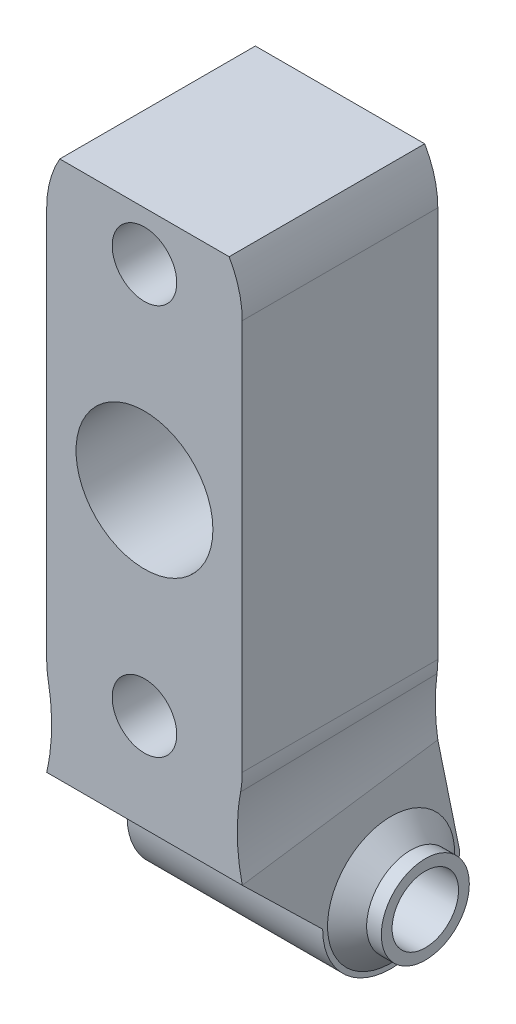
ISO-10303-21;
HEADER;
FILE_DESCRIPTION(('STEP AP214'),'2;1');
FILE_NAME('part.step','',(''),(''),'','','');
FILE_SCHEMA(('AUTOMOTIVE_DESIGN { 1 0 10303 214 1 1 1 1 }'));
ENDSEC;
DATA;
#1=APPLICATION_CONTEXT('core data for automotive mechanical design processes');
#2=APPLICATION_PROTOCOL_DEFINITION('international standard','automotive_design',2000,#1);
#3=PRODUCT_CONTEXT('',#1,'mechanical');
#4=PRODUCT('Part','Part','',(#3));
#5=PRODUCT_RELATED_PRODUCT_CATEGORY('part','',(#4));
#6=PRODUCT_DEFINITION_FORMATION('','',#4);
#7=PRODUCT_DEFINITION_CONTEXT('part definition',#1,'design');
#8=PRODUCT_DEFINITION('design','',#6,#7);
#9=PRODUCT_DEFINITION_SHAPE('','',#8);
#10=(LENGTH_UNIT() NAMED_UNIT(*) SI_UNIT(.MILLI.,.METRE.));
#11=(NAMED_UNIT(*) PLANE_ANGLE_UNIT() SI_UNIT($,.RADIAN.));
#12=(NAMED_UNIT(*) SI_UNIT($,.STERADIAN.) SOLID_ANGLE_UNIT());
#13=UNCERTAINTY_MEASURE_WITH_UNIT(LENGTH_MEASURE(1.E-05),#10,'distance_accuracy_value','');
#14=(GEOMETRIC_REPRESENTATION_CONTEXT(3) GLOBAL_UNCERTAINTY_ASSIGNED_CONTEXT((#13)) GLOBAL_UNIT_ASSIGNED_CONTEXT((#10,
#11,#12)) REPRESENTATION_CONTEXT('',''));
#15=CARTESIAN_POINT('',(0.,0.,0.));
#16=DIRECTION('',(0.,0.,1.));
#17=DIRECTION('',(1.,0.,0.));
#18=AXIS2_PLACEMENT_3D('',#15,#16,#17);
#19=CARTESIAN_POINT('',(0.,10.,10.));
#20=DIRECTION('',(0.,0.,-1.));
#21=DIRECTION('',(-1.,0.,0.));
#22=AXIS2_PLACEMENT_3D('',#19,#20,#21);
#23=CYLINDRICAL_SURFACE('',#22,5.);
#24=CARTESIAN_POINT('',(0.,10.,10.));
#25=DIRECTION('',(0.,0.,1.));
#26=DIRECTION('',(1.,0.,0.));
#27=AXIS2_PLACEMENT_3D('',#24,#25,#26);
#28=CIRCLE('',#27,5.);
#29=CARTESIAN_POINT('',(-4.3301270189222,12.5,10.));
#30=VERTEX_POINT('',#29);
#31=CARTESIAN_POINT('',(-5.,10.,10.));
#32=VERTEX_POINT('',#31);
#33=EDGE_CURVE('E342',#30,#32,#28,.T.);
#34=ORIENTED_EDGE('',*,*,#33,.F.);
#35=DIRECTION('',(0.,0.,-1.));
#36=VECTOR('',#35,1.);
#37=CARTESIAN_POINT('',(-4.3301270189222,12.5,10.));
#38=LINE('',#37,#36);
#39=CARTESIAN_POINT('',(-4.3301270189222,12.5,0.));
#40=VERTEX_POINT('',#39);
#41=EDGE_CURVE('E349',#30,#40,#38,.T.);
#42=ORIENTED_EDGE('',*,*,#41,.T.);
#43=CARTESIAN_POINT('',(0.,10.,0.));
#44=DIRECTION('',(0.,0.,1.));
#45=DIRECTION('',(1.,0.,0.));
#46=AXIS2_PLACEMENT_3D('',#43,#44,#45);
#47=CIRCLE('',#46,5.);
#48=CARTESIAN_POINT('',(-5.,10.,0.));
#49=VERTEX_POINT('',#48);
#50=EDGE_CURVE('E177',#40,#49,#47,.T.);
#51=ORIENTED_EDGE('',*,*,#50,.T.);
#52=DIRECTION('',(0.,0.,-1.));
#53=VECTOR('',#52,1.);
#54=CARTESIAN_POINT('',(-5.,10.,10.));
#55=LINE('',#54,#53);
#56=EDGE_CURVE('E202',#32,#49,#55,.T.);
#57=ORIENTED_EDGE('',*,*,#56,.F.);
#58=EDGE_LOOP('',(#34,#42,#51,#57));
#59=FACE_BOUND('',#58,.T.);
#60=ADVANCED_FACE('F34',(#59),#23,.T.);
#61=CARTESIAN_POINT('',(5.,0.,10.));
#62=DIRECTION('',(1.,0.,0.));
#63=DIRECTION('',(0.,0.,-1.));
#64=AXIS2_PLACEMENT_3D('',#61,#62,#63);
#65=PLANE('',#64);
#66=CARTESIAN_POINT('',(5.,-19.,2.38884796802097));
#67=DIRECTION('',(1.,0.,0.));
#68=DIRECTION('',(0.,0.,-1.));
#69=AXIS2_PLACEMENT_3D('',#66,#67,#68);
#70=CIRCLE('',#69,3.24999999999999);
#71=CARTESIAN_POINT('',(5.,-19.,-0.861152031979026));
#72=VERTEX_POINT('',#71);
#73=EDGE_CURVE('E571',#72,#72,#70,.F.);
#74=ORIENTED_EDGE('',*,*,#73,.T.);
#75=EDGE_LOOP('',(#74));
#76=FACE_BOUND('',#75,.T.);
#77=DIRECTION('',(0.,-0.979775339297235,-0.200100685918334));
#78=VECTOR('',#77,1.);
#79=CARTESIAN_POINT('',(5.,-0.542919919085105,2.65835944285536));
#80=LINE('',#79,#78);
#81=CARTESIAN_POINT('',(5.,-13.5593421924231,0.));
#82=VERTEX_POINT('',#81);
#83=CARTESIAN_POINT('',(5.,-19.,-1.11115203197903));
#84=VERTEX_POINT('',#83);
#85=EDGE_CURVE('E332',#82,#84,#80,.T.);
#86=ORIENTED_EDGE('',*,*,#85,.F.);
#87=DIRECTION('',(0.,0.142593618538282,-0.989781319258026));
#88=VECTOR('',#87,1.);
#89=CARTESIAN_POINT('',(5.,-13.2836409005364,-1.91371809764053));
#90=LINE('',#89,#88);
#91=CARTESIAN_POINT('',(5.,-15.,10.));
#92=VERTEX_POINT('',#91);
#93=EDGE_CURVE('E324',#92,#82,#90,.T.);
#94=ORIENTED_EDGE('',*,*,#93,.F.);
#95=DIRECTION('',(0.,-0.697351394105259,-0.716729400219812));
#96=VECTOR('',#95,1.);
#97=CARTESIAN_POINT('',(5.,-12.7036379614869,12.3601733651982));
#98=LINE('',#97,#96);
#99=CARTESIAN_POINT('',(5.,-19.,5.88884796802097));
#100=VERTEX_POINT('',#99);
#101=EDGE_CURVE('E330',#92,#100,#98,.T.);
#102=ORIENTED_EDGE('',*,*,#101,.T.);
#103=CARTESIAN_POINT('',(5.,-19.,2.38884796802097));
#104=DIRECTION('',(1.,0.,0.));
#105=DIRECTION('',(0.,0.,-1.));
#106=AXIS2_PLACEMENT_3D('',#103,#104,#105);
#107=CIRCLE('',#106,3.5);
#108=EDGE_CURVE('E178',#100,#84,#107,.T.);
#109=ORIENTED_EDGE('',*,*,#108,.T.);
#110=EDGE_LOOP('',(#86,#94,#102,#109));
#111=FACE_BOUND('',#110,.T.);
#112=ADVANCED_FACE('F289',(#76,#111),#65,.T.);
#113=CARTESIAN_POINT('',(-5.,0.,10.));
#114=DIRECTION('',(1.,0.,0.));
#115=DIRECTION('',(0.,0.,-1.));
#116=AXIS2_PLACEMENT_3D('',#113,#114,#115);
#117=PLANE('',#116);
#118=CARTESIAN_POINT('',(-5.,-19.,2.38884796802097));
#119=DIRECTION('',(1.,0.,0.));
#120=DIRECTION('',(0.,0.,-1.));
#121=AXIS2_PLACEMENT_3D('',#118,#119,#120);
#122=CIRCLE('',#121,3.25000000000002);
#123=CARTESIAN_POINT('',(-5.,-19.,-0.861152031979053));
#124=VERTEX_POINT('',#123);
#125=EDGE_CURVE('E11',#124,#124,#122,.T.);
#126=ORIENTED_EDGE('',*,*,#125,.T.);
#127=EDGE_LOOP('',(#126));
#128=FACE_BOUND('',#127,.T.);
#129=CARTESIAN_POINT('',(-5.,-19.,2.38884796802097));
#130=DIRECTION('',(1.,0.,0.));
#131=DIRECTION('',(0.,0.,-1.));
#132=AXIS2_PLACEMENT_3D('',#129,#130,#131);
#133=CIRCLE('',#132,3.5);
#134=CARTESIAN_POINT('',(-5.,-19.,-1.11115203197903));
#135=VERTEX_POINT('',#134);
#136=CARTESIAN_POINT('',(-5.,-19.,5.88884796802097));
#137=VERTEX_POINT('',#136);
#138=EDGE_CURVE('E385',#135,#137,#133,.F.);
#139=ORIENTED_EDGE('',*,*,#138,.T.);
#140=DIRECTION('',(0.,0.697351394105259,0.716729400219812));
#141=VECTOR('',#140,1.);
#142=CARTESIAN_POINT('',(-5.,-12.7036379614869,12.3601733651982));
#143=LINE('',#142,#141);
#144=CARTESIAN_POINT('',(-5.,-15.,10.));
#145=VERTEX_POINT('',#144);
#146=EDGE_CURVE('E388',#137,#145,#143,.T.);
#147=ORIENTED_EDGE('',*,*,#146,.T.);
#148=DIRECTION('',(0.,-0.142593618538282,0.989781319258026));
#149=VECTOR('',#148,1.);
#150=CARTESIAN_POINT('',(-5.,-13.2836409005364,-1.91371809764053));
#151=LINE('',#150,#149);
#152=CARTESIAN_POINT('',(-5.,-13.5593421924231,0.));
#153=VERTEX_POINT('',#152);
#154=EDGE_CURVE('E136',#153,#145,#151,.T.);
#155=ORIENTED_EDGE('',*,*,#154,.F.);
#156=DIRECTION('',(0.,0.979775339297235,0.200100685918334));
#157=VECTOR('',#156,1.);
#158=CARTESIAN_POINT('',(-5.,-0.542919919085105,2.65835944285536));
#159=LINE('',#158,#157);
#160=EDGE_CURVE('E338',#135,#153,#159,.T.);
#161=ORIENTED_EDGE('',*,*,#160,.F.);
#162=EDGE_LOOP('',(#139,#147,#155,#161));
#163=FACE_BOUND('',#162,.T.);
#164=ADVANCED_FACE('F295',(#128,#163),#117,.F.);
#165=CARTESIAN_POINT('',(0.,-10.,10.));
#166=DIRECTION('',(0.,0.,-1.));
#167=DIRECTION('',(-1.,0.,0.));
#168=AXIS2_PLACEMENT_3D('',#165,#166,#167);
#169=CYLINDRICAL_SURFACE('',#168,5.);
#170=CARTESIAN_POINT('',(0.,-10.,0.));
#171=DIRECTION('',(0.,0.,1.));
#172=DIRECTION('',(1.,0.,0.));
#173=AXIS2_PLACEMENT_3D('',#170,#171,#172);
#174=CIRCLE('',#173,5.);
#175=CARTESIAN_POINT('',(-5.,-10.,0.));
#176=VERTEX_POINT('',#175);
#177=CARTESIAN_POINT('',(-4.95751117637002,-10.6504482578702,0.));
#178=VERTEX_POINT('',#177);
#179=EDGE_CURVE('E149',#176,#178,#174,.T.);
#180=ORIENTED_EDGE('',*,*,#179,.T.);
#181=CARTESIAN_POINT('',(-5.,-15.4355662845991,13.0233847504125));
#182=CARTESIAN_POINT('',(-4.44220527723996,-13.2302958211713,13.189043904644));
#183=CARTESIAN_POINT('',(-4.89832509522828,-11.0032005090992,13.3728832572638));
#184=CARTESIAN_POINT('',(-5.,-15.198424623606,11.3773196005489));
#185=CARTESIAN_POINT('',(-4.49195205682825,-13.0886455388384,11.5403303155306));
#186=CARTESIAN_POINT('',(-4.90730936356108,-10.9593299813514,11.7116148343541));
#187=CARTESIAN_POINT('',(-5.,-14.9612792982853,9.7312290155856));
#188=CARTESIAN_POINT('',(-4.53825727444031,-12.9468427536556,9.88718640022528));
#189=CARTESIAN_POINT('',(-4.91567666755318,-10.9154796135729,10.0503117353569));
#190=CARTESIAN_POINT('',(-5.,-14.4869834905433,6.43901204881145));
#191=CARTESIAN_POINT('',(-4.623891721141,-12.6636831423943,6.5815658466589));
#192=CARTESIAN_POINT('',(-4.93119738978409,-10.8278136202016,6.72765398207385));
#193=CARTESIAN_POINT('',(-5.,-14.2498330081509,4.79288566720186));
#194=CARTESIAN_POINT('',(-4.66327404969323,-12.5222386295594,4.92808318404762));
#195=CARTESIAN_POINT('',(-4.93835081364852,-10.7839979944488,5.06629932806257));
#196=CARTESIAN_POINT('',(-5.,-13.7755268678021,1.50059697897684));
#197=CARTESIAN_POINT('',(-4.73527696836469,-12.239732343715,1.62183972234405));
#198=CARTESIAN_POINT('',(-4.95146390123223,-10.6963955023379,1.74354091967718));
#199=CARTESIAN_POINT('',(-5.,-13.5383712098458,-0.14556532763738));
#200=CARTESIAN_POINT('',(-4.76794101610711,-12.0985853870542,-0.0319057415052614));
#201=CARTESIAN_POINT('',(-4.95742356499223,-10.6526086359787,0.0821371653047414));
#202=CARTESIAN_POINT('',(-5.,-13.0640545954361,-3.43792671918469));
#203=CARTESIAN_POINT('',(-4.82668235743353,-11.8166124248527,-3.33866446489152));
#204=CARTESIAN_POINT('',(-4.96816396417613,-10.5650580675183,-3.24071789662139));
#205=CARTESIAN_POINT('',(-5.,-12.8268936389631,-5.08412580425288));
#206=CARTESIAN_POINT('',(-4.85279432668287,-11.6757031485389,-4.99264620153091));
#207=CARTESIAN_POINT('',(-4.97294469413619,-10.5212943655254,-4.90216920435978));
#208=CARTESIAN_POINT('',(-5.,-12.5897310749049,-6.73033604801049));
#209=CARTESIAN_POINT('',(-4.87570460122613,-11.5347820583627,-6.64793207254503));
#210=CARTESIAN_POINT('',(-4.97714334543139,-10.4775396517862,-6.56363578708386));
#211=(BOUNDED_SURFACE() B_SPLINE_SURFACE(3,2,((#181,#182,#183),(#184,#185,#186),(#187,#188,
#189),(#190,#191,#192),(#193,#194,#195),(#196,#197,#198),(#199,#200,#201),(#202,#203,#204),
(#205,#206,#207),(#208,#209,#210)),.UNSPECIFIED.,.F.,.F.,.F.) B_SPLINE_SURFACE_WITH_KNOTS((4,2,
2,2,4),(3,3),(0.,5.0000735121336,10.0001238512251,15.0001740198006,20.0002473609248),(0.,1.),
.UNSPECIFIED.) GEOMETRIC_REPRESENTATION_ITEM() RATIONAL_B_SPLINE_SURFACE(((1.,0.974963648860338,
1.),(1.,0.977176073750898,1.),(1.,0.979236530609515,1.),(1.,0.983058469732894,1.),(1.,
0.984819953383221,1.),(1.,0.988048927919992,1.),(1.,0.98951641881646,1.),(1.,0.992161079273093,
1.),(1.,0.993338247487742,1.),(1.,0.994372083262162,1.))) REPRESENTATION_ITEM('') SURFACE());
#212=CARTESIAN_POINT('',(-4.97714334543139,-10.4775396517862,-6.56363578708386));
#213=CARTESIAN_POINT('',(-4.9729446941362,-10.5212943655254,-4.90216920435978));
#214=CARTESIAN_POINT('',(-4.96816396417613,-10.5650580675183,-3.24071789662139));
#215=CARTESIAN_POINT('',(-4.95742356499223,-10.6526086359787,0.0821371653047407));
#216=CARTESIAN_POINT('',(-4.95146390123223,-10.6963955023379,1.74354091967718));
#217=CARTESIAN_POINT('',(-4.93835081364852,-10.7839979944488,5.06629932806257));
#218=CARTESIAN_POINT('',(-4.93119738978409,-10.8278136202016,6.72765398207385));
#219=CARTESIAN_POINT('',(-4.91567666755319,-10.9154796135729,10.0503117353569));
#220=CARTESIAN_POINT('',(-4.90730936356108,-10.9593299813514,11.7116148343541));
#221=CARTESIAN_POINT('',(-4.89832509522828,-11.0032005090992,13.3728832572638));
#222=B_SPLINE_CURVE_WITH_KNOTS('',3,(#212,#213,#214,#215,#216,#217,#218,#219,#220,#221),
.UNSPECIFIED.,.F.,.F.,(4,2,2,2,4),(0.,5.00007334112417,10.0001235096997,15.0001738487912,
20.0002473609248),.UNSPECIFIED.);
#223=CARTESIAN_POINT('',(-4.91572123924434,-10.914157917453,10.));
#224=VERTEX_POINT('',#223);
#225=EDGE_CURVE('E135',#178,#224,#222,.T.);
#226=ORIENTED_EDGE('',*,*,#225,.T.);
#227=CARTESIAN_POINT('',(0.,-10.,10.));
#228=DIRECTION('',(0.,0.,1.));
#229=DIRECTION('',(1.,0.,0.));
#230=AXIS2_PLACEMENT_3D('',#227,#228,#229);
#231=CIRCLE('',#230,5.);
#232=CARTESIAN_POINT('',(-5.,-10.,10.));
#233=VERTEX_POINT('',#232);
#234=EDGE_CURVE('E147',#233,#224,#231,.T.);
#235=ORIENTED_EDGE('',*,*,#234,.F.);
#236=DIRECTION('',(0.,0.,-1.));
#237=VECTOR('',#236,1.);
#238=CARTESIAN_POINT('',(-5.,-10.,10.));
#239=LINE('',#238,#237);
#240=EDGE_CURVE('E200',#233,#176,#239,.T.);
#241=ORIENTED_EDGE('',*,*,#240,.T.);
#242=EDGE_LOOP('',(#180,#226,#235,#241));
#243=FACE_BOUND('',#242,.T.);
#244=ADVANCED_FACE('F145',(#243),#169,.T.);
#245=CARTESIAN_POINT('',(5.,10.,0.));
#246=VERTEX_POINT('',#245);
#247=CARTESIAN_POINT('',(4.3301270189222,12.5,0.));
#248=VERTEX_POINT('',#247);
#249=EDGE_CURVE('E179',#246,#248,#47,.T.);
#250=ORIENTED_EDGE('',*,*,#249,.T.);
#251=DIRECTION('',(0.,0.,-1.));
#252=VECTOR('',#251,1.);
#253=CARTESIAN_POINT('',(4.3301270189222,12.5,10.));
#254=LINE('',#253,#252);
#255=CARTESIAN_POINT('',(4.3301270189222,12.5,10.));
#256=VERTEX_POINT('',#255);
#257=EDGE_CURVE('E49',#248,#256,#254,.F.);
#258=ORIENTED_EDGE('',*,*,#257,.T.);
#259=CARTESIAN_POINT('',(5.,10.,10.));
#260=VERTEX_POINT('',#259);
#261=EDGE_CURVE('E343',#260,#256,#28,.T.);
#262=ORIENTED_EDGE('',*,*,#261,.F.);
#263=DIRECTION('',(0.,0.,-1.));
#264=VECTOR('',#263,1.);
#265=CARTESIAN_POINT('',(5.,10.,10.));
#266=LINE('',#265,#264);
#267=EDGE_CURVE('E173',#260,#246,#266,.T.);
#268=ORIENTED_EDGE('',*,*,#267,.T.);
#269=EDGE_LOOP('',(#250,#258,#262,#268));
#270=FACE_BOUND('',#269,.T.);
#271=ADVANCED_FACE('F291',(#270),#23,.T.);
#272=CARTESIAN_POINT('',(-5.,0.,10.));
#273=DIRECTION('',(1.,0.,0.));
#274=DIRECTION('',(0.,0.,-1.));
#275=AXIS2_PLACEMENT_3D('',#272,#273,#274);
#276=PLANE('',#275);
#277=DIRECTION('',(0.,-1.,0.));
#278=VECTOR('',#277,1.);
#279=CARTESIAN_POINT('',(-5.,0.,0.));
#280=LINE('',#279,#278);
#281=EDGE_CURVE('E182',#49,#176,#280,.T.);
#282=ORIENTED_EDGE('',*,*,#281,.T.);
#283=ORIENTED_EDGE('',*,*,#240,.F.);
#284=DIRECTION('',(0.,-1.,0.));
#285=VECTOR('',#284,1.);
#286=CARTESIAN_POINT('',(-5.,0.,10.));
#287=LINE('',#286,#285);
#288=EDGE_CURVE('E157',#32,#233,#287,.T.);
#289=ORIENTED_EDGE('',*,*,#288,.F.);
#290=ORIENTED_EDGE('',*,*,#56,.T.);
#291=EDGE_LOOP('',(#282,#283,#289,#290));
#292=FACE_BOUND('',#291,.T.);
#293=ADVANCED_FACE('F299',(#292),#276,.F.);
#294=CARTESIAN_POINT('',(4.91572123924435,-10.914157917453,10.));
#295=VERTEX_POINT('',#294);
#296=CARTESIAN_POINT('',(5.,-10.,10.));
#297=VERTEX_POINT('',#296);
#298=EDGE_CURVE('E160',#295,#297,#231,.T.);
#299=ORIENTED_EDGE('',*,*,#298,.F.);
#300=CARTESIAN_POINT('',(4.89832509522828,-11.0032005090992,13.3728832572638));
#301=CARTESIAN_POINT('',(4.44220527723997,-13.2302958211713,13.189043904644));
#302=CARTESIAN_POINT('',(5.,-15.4355662845991,13.0233847504125));
#303=CARTESIAN_POINT('',(4.90730936356108,-10.9593299813514,11.7116148343541));
#304=CARTESIAN_POINT('',(4.49195205682825,-13.0886455388384,11.5403303155306));
#305=CARTESIAN_POINT('',(5.,-15.198424623606,11.3773196005489));
#306=CARTESIAN_POINT('',(4.91567666755319,-10.9154796135729,10.0503117353569));
#307=CARTESIAN_POINT('',(4.53825727444031,-12.9468427536556,9.88718640022528));
#308=CARTESIAN_POINT('',(5.,-14.9612792982853,9.7312290155856));
#309=CARTESIAN_POINT('',(4.93119738978409,-10.8278136202016,6.72765398207386));
#310=CARTESIAN_POINT('',(4.623891721141,-12.6636831423943,6.5815658466589));
#311=CARTESIAN_POINT('',(5.,-14.4869834905433,6.43901204881145));
#312=CARTESIAN_POINT('',(4.93835081364852,-10.7839979944488,5.06629932806257));
#313=CARTESIAN_POINT('',(4.66327404969323,-12.5222386295594,4.92808318404762));
#314=CARTESIAN_POINT('',(5.,-14.2498330081509,4.79288566720187));
#315=CARTESIAN_POINT('',(4.95146390123223,-10.6963955023379,1.74354091967718));
#316=CARTESIAN_POINT('',(4.73527696836469,-12.239732343715,1.62183972234405));
#317=CARTESIAN_POINT('',(5.,-13.7755268678021,1.50059697897684));
#318=CARTESIAN_POINT('',(4.95742356499223,-10.6526086359787,0.0821371653047425));
#319=CARTESIAN_POINT('',(4.76794101610711,-12.0985853870542,-0.0319057415052574));
#320=CARTESIAN_POINT('',(5.,-13.5383712098458,-0.145565327637377));
#321=CARTESIAN_POINT('',(4.96816396417613,-10.5650580675183,-3.24071789662139));
#322=CARTESIAN_POINT('',(4.82668235743354,-11.8166124248527,-3.33866446489152));
#323=CARTESIAN_POINT('',(5.,-13.0640545954361,-3.43792671918469));
#324=CARTESIAN_POINT('',(4.9729446941362,-10.5212943655254,-4.90216920435978));
#325=CARTESIAN_POINT('',(4.85279432668287,-11.6757031485389,-4.99264620153091));
#326=CARTESIAN_POINT('',(5.,-12.8268936389631,-5.08412580425288));
#327=CARTESIAN_POINT('',(4.97714334543139,-10.4775396517862,-6.56363578708385));
#328=CARTESIAN_POINT('',(4.87570460122613,-11.5347820583627,-6.64793207254502));
#329=CARTESIAN_POINT('',(5.,-12.5897310749049,-6.73033604801048));
#330=(BOUNDED_SURFACE() B_SPLINE_SURFACE(3,2,((#300,#301,#302),(#303,#304,#305),(#306,#307,
#308),(#309,#310,#311),(#312,#313,#314),(#315,#316,#317),(#318,#319,#320),(#321,#322,#323),
(#324,#325,#326),(#327,#328,#329)),.UNSPECIFIED.,.F.,.F.,.F.) B_SPLINE_SURFACE_WITH_KNOTS((4,2,
2,2,4),(3,3),(0.,5.0000735121336,10.0001238512251,15.0001740198006,20.0002473609248),(0.,1.),
.UNSPECIFIED.) GEOMETRIC_REPRESENTATION_ITEM() RATIONAL_B_SPLINE_SURFACE(((1.,0.974963648860338,
1.),(1.,0.977176073750898,1.),(1.,0.979236530609515,1.),(1.,0.983058469732894,1.),(1.,
0.984819953383222,1.),(1.,0.988048927919992,1.),(1.,0.98951641881646,1.),(1.,0.992161079273093,
1.),(1.,0.993338247487742,1.),(1.,0.994372083262162,1.))) REPRESENTATION_ITEM('') SURFACE());
#331=CARTESIAN_POINT('',(4.89832509522828,-11.0032005090992,13.3728832572638));
#332=CARTESIAN_POINT('',(4.90730936356108,-10.9593299813514,11.7116148343541));
#333=CARTESIAN_POINT('',(4.91567666755319,-10.9154796135729,10.0503117353569));
#334=CARTESIAN_POINT('',(4.93119738978409,-10.8278136202016,6.72765398207385));
#335=CARTESIAN_POINT('',(4.93835081364852,-10.7839979944488,5.06629932806257));
#336=CARTESIAN_POINT('',(4.95146390123223,-10.6963955023379,1.74354091967718));
#337=CARTESIAN_POINT('',(4.95742356499223,-10.6526086359787,0.0821371653047416));
#338=CARTESIAN_POINT('',(4.96816396417613,-10.5650580675183,-3.24071789662139));
#339=CARTESIAN_POINT('',(4.9729446941362,-10.5212943655254,-4.90216920435978));
#340=CARTESIAN_POINT('',(4.97714334543139,-10.4775396517862,-6.56363578708385));
#341=B_SPLINE_CURVE_WITH_KNOTS('',3,(#331,#332,#333,#334,#335,#336,#337,#338,#339,#340),
.UNSPECIFIED.,.F.,.F.,(4,2,2,2,4),(0.,5.0000735121336,10.0001238512251,15.0001740198006,
20.0002473609248),.UNSPECIFIED.);
#342=CARTESIAN_POINT('',(4.95751117637002,-10.6504482578702,0.));
#343=VERTEX_POINT('',#342);
#344=EDGE_CURVE('E151',#295,#343,#341,.T.);
#345=ORIENTED_EDGE('',*,*,#344,.T.);
#346=CARTESIAN_POINT('',(5.,-10.,0.));
#347=VERTEX_POINT('',#346);
#348=EDGE_CURVE('E184',#343,#347,#174,.T.);
#349=ORIENTED_EDGE('',*,*,#348,.T.);
#350=DIRECTION('',(0.,0.,-1.));
#351=VECTOR('',#350,1.);
#352=CARTESIAN_POINT('',(5.,-10.,10.));
#353=LINE('',#352,#351);
#354=EDGE_CURVE('E197',#297,#347,#353,.T.);
#355=ORIENTED_EDGE('',*,*,#354,.F.);
#356=EDGE_LOOP('',(#299,#345,#349,#355));
#357=FACE_BOUND('',#356,.T.);
#358=ADVANCED_FACE('F219',(#357),#169,.T.);
#359=CARTESIAN_POINT('',(0.,0.,10.));
#360=DIRECTION('',(0.,0.,-1.));
#361=DIRECTION('',(-1.,0.,0.));
#362=AXIS2_PLACEMENT_3D('',#359,#360,#361);
#363=CYLINDRICAL_SURFACE('',#362,3.5);
#364=CARTESIAN_POINT('',(0.,0.,10.));
#365=DIRECTION('',(0.,0.,1.));
#366=DIRECTION('',(1.,0.,0.));
#367=AXIS2_PLACEMENT_3D('',#364,#365,#366);
#368=CIRCLE('',#367,3.5);
#369=CARTESIAN_POINT('',(3.5,0.,10.));
#370=VERTEX_POINT('',#369);
#371=EDGE_CURVE('E163',#370,#370,#368,.T.);
#372=ORIENTED_EDGE('',*,*,#371,.T.);
#373=EDGE_LOOP('',(#372));
#374=FACE_BOUND('',#373,.T.);
#375=CARTESIAN_POINT('',(0.,0.,0.));
#376=DIRECTION('',(0.,0.,1.));
#377=DIRECTION('',(1.,0.,0.));
#378=AXIS2_PLACEMENT_3D('',#375,#376,#377);
#379=CIRCLE('',#378,3.5);
#380=CARTESIAN_POINT('',(3.5,0.,0.));
#381=VERTEX_POINT('',#380);
#382=EDGE_CURVE('E189',#381,#381,#379,.T.);
#383=ORIENTED_EDGE('',*,*,#382,.F.);
#384=EDGE_LOOP('',(#383));
#385=FACE_BOUND('',#384,.T.);
#386=ADVANCED_FACE('F494',(#374,#385),#363,.F.);
#387=CARTESIAN_POINT('',(5.,0.,10.));
#388=DIRECTION('',(1.,0.,0.));
#389=DIRECTION('',(0.,0.,-1.));
#390=AXIS2_PLACEMENT_3D('',#387,#388,#389);
#391=PLANE('',#390);
#392=DIRECTION('',(0.,-1.,0.));
#393=VECTOR('',#392,1.);
#394=CARTESIAN_POINT('',(5.,0.,0.));
#395=LINE('',#394,#393);
#396=EDGE_CURVE('E186',#246,#347,#395,.T.);
#397=ORIENTED_EDGE('',*,*,#396,.F.);
#398=ORIENTED_EDGE('',*,*,#267,.F.);
#399=DIRECTION('',(0.,-1.,0.));
#400=VECTOR('',#399,1.);
#401=CARTESIAN_POINT('',(5.,0.,10.));
#402=LINE('',#401,#400);
#403=EDGE_CURVE('E159',#260,#297,#402,.T.);
#404=ORIENTED_EDGE('',*,*,#403,.T.);
#405=ORIENTED_EDGE('',*,*,#354,.T.);
#406=EDGE_LOOP('',(#397,#398,#404,#405));
#407=FACE_BOUND('',#406,.T.);
#408=ADVANCED_FACE('F315',(#407),#391,.T.);
#409=CARTESIAN_POINT('',(0.,10.,10.));
#410=DIRECTION('',(0.,0.,-1.));
#411=DIRECTION('',(-1.,0.,0.));
#412=AXIS2_PLACEMENT_3D('',#409,#410,#411);
#413=CYLINDRICAL_SURFACE('',#412,1.65);
#414=CARTESIAN_POINT('',(0.,10.,10.));
#415=DIRECTION('',(0.,0.,1.));
#416=DIRECTION('',(1.,0.,0.));
#417=AXIS2_PLACEMENT_3D('',#414,#415,#416);
#418=CIRCLE('',#417,1.65);
#419=CARTESIAN_POINT('',(1.65,10.,10.));
#420=VERTEX_POINT('',#419);
#421=EDGE_CURVE('E195',#420,#420,#418,.T.);
#422=ORIENTED_EDGE('',*,*,#421,.T.);
#423=EDGE_LOOP('',(#422));
#424=FACE_BOUND('',#423,.T.);
#425=CARTESIAN_POINT('',(0.,10.,0.));
#426=DIRECTION('',(0.,0.,1.));
#427=DIRECTION('',(1.,0.,0.));
#428=AXIS2_PLACEMENT_3D('',#425,#426,#427);
#429=CIRCLE('',#428,1.65);
#430=CARTESIAN_POINT('',(1.65,10.,0.));
#431=VERTEX_POINT('',#430);
#432=EDGE_CURVE('E174',#431,#431,#429,.T.);
#433=ORIENTED_EDGE('',*,*,#432,.F.);
#434=EDGE_LOOP('',(#433));
#435=FACE_BOUND('',#434,.T.);
#436=ADVANCED_FACE('F226',(#424,#435),#413,.F.);
#437=CARTESIAN_POINT('',(0.,-10.,10.));
#438=DIRECTION('',(0.,0.,-1.));
#439=DIRECTION('',(-1.,0.,0.));
#440=AXIS2_PLACEMENT_3D('',#437,#438,#439);
#441=CYLINDRICAL_SURFACE('',#440,1.65);
#442=CARTESIAN_POINT('',(0.,-10.,10.));
#443=DIRECTION('',(0.,0.,1.));
#444=DIRECTION('',(1.,0.,0.));
#445=AXIS2_PLACEMENT_3D('',#442,#443,#444);
#446=CIRCLE('',#445,1.65);
#447=CARTESIAN_POINT('',(1.65,-10.,10.));
#448=VERTEX_POINT('',#447);
#449=EDGE_CURVE('E170',#448,#448,#446,.T.);
#450=ORIENTED_EDGE('',*,*,#449,.T.);
#451=EDGE_LOOP('',(#450));
#452=FACE_BOUND('',#451,.T.);
#453=CARTESIAN_POINT('',(0.,-10.,0.));
#454=DIRECTION('',(0.,0.,1.));
#455=DIRECTION('',(1.,0.,0.));
#456=AXIS2_PLACEMENT_3D('',#453,#454,#455);
#457=CIRCLE('',#456,1.65);
#458=CARTESIAN_POINT('',(1.65,-10.,0.));
#459=VERTEX_POINT('',#458);
#460=EDGE_CURVE('E192',#459,#459,#457,.T.);
#461=ORIENTED_EDGE('',*,*,#460,.F.);
#462=EDGE_LOOP('',(#461));
#463=FACE_BOUND('',#462,.T.);
#464=ADVANCED_FACE('F368',(#452,#463),#441,.F.);
#465=CARTESIAN_POINT('',(0.,0.,10.));
#466=DIRECTION('',(0.,0.,1.));
#467=DIRECTION('',(1.,0.,0.));
#468=AXIS2_PLACEMENT_3D('',#465,#466,#467);
#469=PLANE('',#468);
#470=DIRECTION('',(-1.,0.,0.));
#471=VECTOR('',#470,1.);
#472=CARTESIAN_POINT('',(8.93580716293718,12.5,10.));
#473=LINE('',#472,#471);
#474=EDGE_CURVE('E344',#256,#30,#473,.T.);
#475=ORIENTED_EDGE('',*,*,#474,.T.);
#476=ORIENTED_EDGE('',*,*,#33,.T.);
#477=ORIENTED_EDGE('',*,*,#288,.T.);
#478=ORIENTED_EDGE('',*,*,#234,.T.);
#479=CARTESIAN_POINT('',(-4.91572123924434,-10.914157917453,10.));
#480=CARTESIAN_POINT('',(-4.86355369800997,-11.1944997904377,10.));
#481=CARTESIAN_POINT('',(-4.82336177436077,-11.477071726427,10.));
#482=CARTESIAN_POINT('',(-4.76706698838271,-12.044774728936,10.));
#483=CARTESIAN_POINT('',(-4.75097839544977,-12.3299072109308,10.));
#484=CARTESIAN_POINT('',(-4.74315685034231,-12.8956735371384,10.));
#485=CARTESIAN_POINT('',(-4.75101699807947,-13.1763019964913,10.));
#486=CARTESIAN_POINT('',(-4.7901527475443,-13.7357667668125,10.));
#487=CARTESIAN_POINT('',(-4.82141199998185,-14.0146041920653,10.));
#488=CARTESIAN_POINT('',(-4.88259226430447,-14.4101971251059,10.));
#489=CARTESIAN_POINT('',(-4.90306129865687,-14.5284782640445,10.));
#490=CARTESIAN_POINT('',(-4.9483049542573,-14.7646648551134,10.));
#491=CARTESIAN_POINT('',(-4.97309512137527,-14.8825673293482,10.));
#492=CARTESIAN_POINT('',(-5.,-15.,10.));
#493=B_SPLINE_CURVE_WITH_KNOTS('',3,(#479,#480,#481,#482,#483,#484,#485,#486,#487,#488,#489,
#490,#491,#492),.UNSPECIFIED.,.F.,.F.,(4,2,2,2,2,2,4),(0.,0.855212955531403,1.71093200529566,
2.55219354220279,3.39286782563395,3.7529225668664,4.1143004473328),.UNSPECIFIED.);
#494=EDGE_CURVE('E131',#224,#145,#493,.T.);
#495=ORIENTED_EDGE('',*,*,#494,.T.);
#496=DIRECTION('',(1.,0.,0.));
#497=VECTOR('',#496,1.);
#498=CARTESIAN_POINT('',(19.2615939330054,-15.,10.));
#499=LINE('',#498,#497);
#500=EDGE_CURVE('E58',#145,#92,#499,.T.);
#501=ORIENTED_EDGE('',*,*,#500,.T.);
#502=CARTESIAN_POINT('',(5.,-15.,10.));
#503=CARTESIAN_POINT('',(4.94094282440361,-14.7423387021609,10.));
#504=CARTESIAN_POINT('',(4.89209752703975,-14.4823374811055,10.));
#505=CARTESIAN_POINT('',(4.81500596794214,-13.9591820997166,10.));
#506=CARTESIAN_POINT('',(4.78676871791181,-13.6960266111161,10.));
#507=CARTESIAN_POINT('',(4.75140010303241,-13.1724568298004,10.));
#508=CARTESIAN_POINT('',(4.74394459402945,-12.9120642950783,10.));
#509=CARTESIAN_POINT('',(4.74924536342845,-12.3915998662162,10.));
#510=CARTESIAN_POINT('',(4.76199101699254,-12.1315278754741,10.));
#511=CARTESIAN_POINT('',(4.79888082188476,-11.7121351394524,10.));
#512=CARTESIAN_POINT('',(4.81681841455204,-11.5522431371325,10.));
#513=CARTESIAN_POINT('',(4.86044088988747,-11.2327176482664,10.));
#514=CARTESIAN_POINT('',(4.88616347163516,-11.0730893080491,10.));
#515=CARTESIAN_POINT('',(4.91572123924435,-10.914157917453,10.));
#516=B_SPLINE_CURVE_WITH_KNOTS('',3,(#502,#503,#504,#505,#506,#507,#508,#509,#510,#511,#512,
#513,#514,#515),.UNSPECIFIED.,.F.,.F.,(4,2,2,2,2,2,4),(0.,0.792824615418543,1.58599571812009,
2.3667241570065,3.14704210660795,3.62955792070574,4.11444877170025),.UNSPECIFIED.);
#517=EDGE_CURVE('E140',#92,#295,#516,.T.);
#518=ORIENTED_EDGE('',*,*,#517,.T.);
#519=ORIENTED_EDGE('',*,*,#298,.T.);
#520=ORIENTED_EDGE('',*,*,#403,.F.);
#521=ORIENTED_EDGE('',*,*,#261,.T.);
#522=EDGE_LOOP('',(#475,#476,#477,#478,#495,#501,#518,#519,#520,#521));
#523=FACE_BOUND('',#522,.T.);
#524=ORIENTED_EDGE('',*,*,#421,.F.);
#525=EDGE_LOOP('',(#524));
#526=FACE_BOUND('',#525,.T.);
#527=ORIENTED_EDGE('',*,*,#371,.F.);
#528=EDGE_LOOP('',(#527));
#529=FACE_BOUND('',#528,.T.);
#530=ORIENTED_EDGE('',*,*,#449,.F.);
#531=EDGE_LOOP('',(#530));
#532=FACE_BOUND('',#531,.T.);
#533=ADVANCED_FACE('F154',(#523,#526,#529,#532),#469,.T.);
#534=CARTESIAN_POINT('',(0.,0.,0.));
#535=DIRECTION('',(0.,0.,1.));
#536=DIRECTION('',(1.,0.,0.));
#537=AXIS2_PLACEMENT_3D('',#534,#535,#536);
#538=PLANE('',#537);
#539=ORIENTED_EDGE('',*,*,#432,.T.);
#540=EDGE_LOOP('',(#539));
#541=FACE_BOUND('',#540,.T.);
#542=ORIENTED_EDGE('',*,*,#50,.F.);
#543=DIRECTION('',(1.,0.,0.));
#544=VECTOR('',#543,1.);
#545=CARTESIAN_POINT('',(0.,12.5,0.));
#546=LINE('',#545,#544);
#547=EDGE_CURVE('E273',#40,#248,#546,.T.);
#548=ORIENTED_EDGE('',*,*,#547,.T.);
#549=ORIENTED_EDGE('',*,*,#249,.F.);
#550=ORIENTED_EDGE('',*,*,#396,.T.);
#551=ORIENTED_EDGE('',*,*,#348,.F.);
#552=CARTESIAN_POINT('',(4.95751117637002,-10.6504482578702,0.));
#553=CARTESIAN_POINT('',(4.92576402082987,-10.8922993325348,0.));
#554=CARTESIAN_POINT('',(4.90284017316136,-11.1353059198988,0.));
#555=CARTESIAN_POINT('',(4.87476621442223,-11.6210676092498,0.));
#556=CARTESIAN_POINT('',(4.86952373548966,-11.8638173745725,0.));
#557=CARTESIAN_POINT('',(4.8766067927336,-12.3490607395569,0.));
#558=CARTESIAN_POINT('',(4.88893233806487,-12.5915543390851,0.));
#559=CARTESIAN_POINT('',(4.93117951311774,-13.0762892642071,0.));
#560=CARTESIAN_POINT('',(4.96119335203399,-13.3185225544573,0.));
#561=CARTESIAN_POINT('',(5.,-13.5593421924231,0.));
#562=B_SPLINE_CURVE_WITH_KNOTS('',3,(#552,#553,#554,#555,#556,#557,#558,#559,#560,#561),
.UNSPECIFIED.,.F.,.F.,(4,2,2,2,4),(0.,0.731612480119779,1.45939703082833,2.18718196078742,
2.91879482318199),.UNSPECIFIED.);
#563=EDGE_CURVE('E150',#343,#82,#562,.T.);
#564=ORIENTED_EDGE('',*,*,#563,.T.);
#565=DIRECTION('',(-1.,0.,0.));
#566=VECTOR('',#565,1.);
#567=CARTESIAN_POINT('',(0.,-13.5593421924231,0.));
#568=LINE('',#567,#566);
#569=EDGE_CURVE('E72',#82,#153,#568,.T.);
#570=ORIENTED_EDGE('',*,*,#569,.T.);
#571=CARTESIAN_POINT('',(-5.,-13.5593421924231,0.));
#572=CARTESIAN_POINT('',(-4.96119335204561,-13.3185225544295,0.));
#573=CARTESIAN_POINT('',(-4.93117951312094,-13.0762892641519,0.));
#574=CARTESIAN_POINT('',(-4.88893233804741,-12.591554338976,0.));
#575=CARTESIAN_POINT('',(-4.87660679270388,-12.3490607394214,0.));
#576=CARTESIAN_POINT('',(-4.86952373546777,-11.8638173744378,0.));
#577=CARTESIAN_POINT('',(-4.87476621441655,-11.6210676091424,0.));
#578=CARTESIAN_POINT('',(-4.90284017317638,-11.1353059198454,0.));
#579=CARTESIAN_POINT('',(-4.92576402084937,-10.8922993325082,0.));
#580=CARTESIAN_POINT('',(-4.95751117637002,-10.6504482578702,0.));
#581=B_SPLINE_CURVE_WITH_KNOTS('',3,(#571,#572,#573,#574,#575,#576,#577,#578,#579,#580),
.UNSPECIFIED.,.F.,.F.,(4,2,2,2,4),(0.,0.731612862477358,1.45939779251681,2.18718234314427,
2.91879482318371),.UNSPECIFIED.);
#582=EDGE_CURVE('E139',#153,#178,#581,.T.);
#583=ORIENTED_EDGE('',*,*,#582,.T.);
#584=ORIENTED_EDGE('',*,*,#179,.F.);
#585=ORIENTED_EDGE('',*,*,#281,.F.);
#586=EDGE_LOOP('',(#542,#548,#549,#550,#551,#564,#570,#583,#584,#585));
#587=FACE_BOUND('',#586,.T.);
#588=ORIENTED_EDGE('',*,*,#382,.T.);
#589=EDGE_LOOP('',(#588));
#590=FACE_BOUND('',#589,.T.);
#591=ORIENTED_EDGE('',*,*,#460,.T.);
#592=EDGE_LOOP('',(#591));
#593=FACE_BOUND('',#592,.T.);
#594=ADVANCED_FACE('F311',(#541,#587,#590,#593),#538,.F.);
#595=CARTESIAN_POINT('',(19.2615939330054,-0.542919919085105,2.65835944285536));
#596=DIRECTION('',(0.,0.200100685918334,-0.979775339297235));
#597=DIRECTION('',(0.,0.979775339297235,0.200100685918334));
#598=AXIS2_PLACEMENT_3D('',#595,#596,#597);
#599=PLANE('',#598);
#600=ORIENTED_EDGE('',*,*,#569,.F.);
#601=ORIENTED_EDGE('',*,*,#85,.T.);
#602=DIRECTION('',(-1.,0.,0.));
#603=VECTOR('',#602,1.);
#604=CARTESIAN_POINT('',(19.2615939330054,-19.,-1.11115203197903));
#605=LINE('',#604,#603);
#606=EDGE_CURVE('E83',#84,#135,#605,.T.);
#607=ORIENTED_EDGE('',*,*,#606,.T.);
#608=ORIENTED_EDGE('',*,*,#160,.T.);
#609=EDGE_LOOP('',(#600,#601,#607,#608));
#610=FACE_BOUND('',#609,.T.);
#611=ADVANCED_FACE('F365',(#610),#599,.T.);
#612=CARTESIAN_POINT('',(19.2615939330054,-12.7036379614869,12.3601733651982));
#613=DIRECTION('',(0.,0.716729400219812,-0.697351394105259));
#614=DIRECTION('',(0.,0.697351394105259,0.716729400219812));
#615=AXIS2_PLACEMENT_3D('',#612,#613,#614);
#616=PLANE('',#615);
#617=ORIENTED_EDGE('',*,*,#101,.F.);
#618=ORIENTED_EDGE('',*,*,#500,.F.);
#619=ORIENTED_EDGE('',*,*,#146,.F.);
#620=DIRECTION('',(-1.,0.,0.));
#621=VECTOR('',#620,1.);
#622=CARTESIAN_POINT('',(19.2615939330054,-19.,5.88884796802097));
#623=LINE('',#622,#621);
#624=EDGE_CURVE('E328',#100,#137,#623,.T.);
#625=ORIENTED_EDGE('',*,*,#624,.F.);
#626=EDGE_LOOP('',(#617,#618,#619,#625));
#627=FACE_BOUND('',#626,.T.);
#628=ADVANCED_FACE('F379',(#627),#616,.F.);
#629=CARTESIAN_POINT('',(19.2615939330054,-19.,2.38884796802097));
#630=DIRECTION('',(-1.,0.,0.));
#631=DIRECTION('',(0.,0.,1.));
#632=AXIS2_PLACEMENT_3D('',#629,#630,#631);
#633=CYLINDRICAL_SURFACE('',#632,3.5);
#634=ORIENTED_EDGE('',*,*,#108,.F.);
#635=ORIENTED_EDGE('',*,*,#624,.T.);
#636=ORIENTED_EDGE('',*,*,#138,.F.);
#637=ORIENTED_EDGE('',*,*,#606,.F.);
#638=EDGE_LOOP('',(#634,#635,#636,#637));
#639=FACE_BOUND('',#638,.T.);
#640=ADVANCED_FACE('F382',(#639),#633,.T.);
#641=CARTESIAN_POINT('',(-6.75,-19.,2.38884796802097));
#642=DIRECTION('',(1.,0.,0.));
#643=DIRECTION('',(0.,0.,-1.));
#644=AXIS2_PLACEMENT_3D('',#641,#642,#643);
#645=CYLINDRICAL_SURFACE('',#644,2.25);
#646=CARTESIAN_POINT('',(-6.00000000000003,-19.,2.38884796802097));
#647=DIRECTION('',(1.,0.,0.));
#648=DIRECTION('',(0.,0.,-1.));
#649=AXIS2_PLACEMENT_3D('',#646,#647,#648);
#650=CIRCLE('',#649,2.25);
#651=CARTESIAN_POINT('',(-6.00000000000003,-19.,0.138847968020961));
#652=VERTEX_POINT('',#651);
#653=EDGE_CURVE('E42',#652,#652,#650,.F.);
#654=CARTESIAN_POINT('',(-6.75,-19.,2.38884796802097));
#655=DIRECTION('',(-1.,0.,0.));
#656=DIRECTION('',(0.,0.,1.));
#657=AXIS2_PLACEMENT_3D('',#654,#655,#656);
#658=CIRCLE('',#657,2.25);
#659=CARTESIAN_POINT('',(-6.75,-19.,0.138847968020961));
#660=VERTEX_POINT('',#659);
#661=EDGE_CURVE('E391',#660,#660,#658,.T.);
#662=CARTESIAN_POINT('',(-6.00000000000003,-19.,0.138847968020961));
#663=CARTESIAN_POINT('',(-6.00781250000003,-19.,0.138847968020961));
#664=CARTESIAN_POINT('',(-6.01562500000003,-19.,0.138847968020961));
#665=CARTESIAN_POINT('',(-6.03125000000003,-19.,0.138847968020961));
#666=CARTESIAN_POINT('',(-6.03906250000002,-19.,0.138847968020961));
#667=CARTESIAN_POINT('',(-6.05468750000003,-19.,0.138847968020961));
#668=CARTESIAN_POINT('',(-6.06250000000002,-19.,0.138847968020961));
#669=CARTESIAN_POINT('',(-6.07812500000002,-19.,0.138847968020961));
#670=CARTESIAN_POINT('',(-6.08593750000002,-19.,0.138847968020961));
#671=CARTESIAN_POINT('',(-6.10156250000002,-19.,0.138847968020961));
#672=CARTESIAN_POINT('',(-6.10937500000002,-19.,0.138847968020961));
#673=CARTESIAN_POINT('',(-6.12500000000002,-19.,0.138847968020961));
#674=CARTESIAN_POINT('',(-6.13281250000002,-19.,0.138847968020961));
#675=CARTESIAN_POINT('',(-6.14843750000002,-19.,0.138847968020961));
#676=CARTESIAN_POINT('',(-6.15625000000002,-19.,0.138847968020961));
#677=CARTESIAN_POINT('',(-6.17187500000002,-19.,0.138847968020961));
#678=CARTESIAN_POINT('',(-6.17968750000002,-19.,0.138847968020961));
#679=CARTESIAN_POINT('',(-6.19531250000002,-19.,0.138847968020961));
#680=CARTESIAN_POINT('',(-6.20312500000002,-19.,0.138847968020961));
#681=CARTESIAN_POINT('',(-6.21875000000002,-19.,0.138847968020961));
#682=CARTESIAN_POINT('',(-6.22656250000002,-19.,0.138847968020961));
#683=CARTESIAN_POINT('',(-6.24218750000002,-19.,0.138847968020961));
#684=CARTESIAN_POINT('',(-6.25000000000002,-19.,0.138847968020961));
#685=CARTESIAN_POINT('',(-6.26562500000002,-19.,0.138847968020961));
#686=CARTESIAN_POINT('',(-6.27343750000002,-19.,0.138847968020961));
#687=CARTESIAN_POINT('',(-6.28906250000002,-19.,0.138847968020961));
#688=CARTESIAN_POINT('',(-6.29687500000002,-19.,0.138847968020961));
#689=CARTESIAN_POINT('',(-6.31250000000002,-19.,0.138847968020961));
#690=CARTESIAN_POINT('',(-6.32031250000002,-19.,0.138847968020961));
#691=CARTESIAN_POINT('',(-6.33593750000002,-19.,0.138847968020961));
#692=CARTESIAN_POINT('',(-6.34375000000001,-19.,0.138847968020961));
#693=CARTESIAN_POINT('',(-6.35937500000001,-19.,0.138847968020961));
#694=CARTESIAN_POINT('',(-6.36718750000001,-19.,0.138847968020961));
#695=CARTESIAN_POINT('',(-6.38281250000001,-19.,0.138847968020961));
#696=CARTESIAN_POINT('',(-6.39062500000001,-19.,0.138847968020961));
#697=CARTESIAN_POINT('',(-6.40625000000001,-19.,0.138847968020961));
#698=CARTESIAN_POINT('',(-6.41406250000001,-19.,0.138847968020961));
#699=CARTESIAN_POINT('',(-6.42968750000001,-19.,0.138847968020961));
#700=CARTESIAN_POINT('',(-6.43750000000001,-19.,0.138847968020961));
#701=CARTESIAN_POINT('',(-6.45312500000001,-19.,0.138847968020961));
#702=CARTESIAN_POINT('',(-6.46093750000001,-19.,0.138847968020961));
#703=CARTESIAN_POINT('',(-6.47656250000001,-19.,0.138847968020961));
#704=CARTESIAN_POINT('',(-6.48437500000001,-19.,0.138847968020961));
#705=CARTESIAN_POINT('',(-6.50000000000001,-19.,0.138847968020961));
#706=CARTESIAN_POINT('',(-6.50781250000001,-19.,0.138847968020961));
#707=CARTESIAN_POINT('',(-6.52343750000001,-19.,0.138847968020961));
#708=CARTESIAN_POINT('',(-6.53125000000001,-19.,0.138847968020961));
#709=CARTESIAN_POINT('',(-6.54687500000001,-19.,0.138847968020961));
#710=CARTESIAN_POINT('',(-6.55468750000001,-19.,0.138847968020961));
#711=CARTESIAN_POINT('',(-6.57031250000001,-19.,0.138847968020961));
#712=CARTESIAN_POINT('',(-6.57812500000001,-19.,0.138847968020961));
#713=CARTESIAN_POINT('',(-6.59375000000001,-19.,0.138847968020961));
#714=CARTESIAN_POINT('',(-6.60156250000001,-19.,0.138847968020961));
#715=CARTESIAN_POINT('',(-6.61718750000001,-19.,0.138847968020961));
#716=CARTESIAN_POINT('',(-6.625,-19.,0.138847968020961));
#717=CARTESIAN_POINT('',(-6.640625,-19.,0.138847968020961));
#718=CARTESIAN_POINT('',(-6.6484375,-19.,0.138847968020961));
#719=CARTESIAN_POINT('',(-6.6640625,-19.,0.138847968020961));
#720=CARTESIAN_POINT('',(-6.671875,-19.,0.138847968020961));
#721=CARTESIAN_POINT('',(-6.6875,-19.,0.138847968020961));
#722=CARTESIAN_POINT('',(-6.6953125,-19.,0.138847968020961));
#723=CARTESIAN_POINT('',(-6.7109375,-19.,0.138847968020961));
#724=CARTESIAN_POINT('',(-6.71875,-19.,0.138847968020961));
#725=CARTESIAN_POINT('',(-6.734375,-19.,0.138847968020961));
#726=CARTESIAN_POINT('',(-6.7421875,-19.,0.138847968020961));
#727=CARTESIAN_POINT('',(-6.75,-19.,0.138847968020961));
#728=B_SPLINE_CURVE_WITH_KNOTS('',3,(#662,#663,#664,#665,#666,#667,#668,#669,#670,#671,#672,
#673,#674,#675,#676,#677,#678,#679,#680,#681,#682,#683,#684,#685,#686,#687,#688,#689,#690,#691,
#692,#693,#694,#695,#696,#697,#698,#699,#700,#701,#702,#703,#704,#705,#706,#707,#708,#709,#710,
#711,#712,#713,#714,#715,#716,#717,#718,#719,#720,#721,#722,#723,#724,#725,#726,#727),
.UNSPECIFIED.,.F.,.F.,(4,2,2,2,2,2,2,2,2,2,2,2,2,2,2,2,2,2,2,2,2,2,2,2,2,2,2,2,2,2,2,2,4),(0.,
0.0234374999999992,0.0468749999999983,0.0703124999999975,0.0937499999999966,0.117187499999996,
0.140624999999995,0.164062499999994,0.187499999999993,0.210937499999992,0.234374999999992,
0.257812499999991,0.28124999999999,0.304687499999989,0.328124999999988,0.351562499999987,
0.374999999999986,0.398437499999986,0.421874999999985,0.445312499999984,0.468749999999983,
0.492187499999982,0.515624999999981,0.539062499999981,0.56249999999998,0.585937499999979,
0.609374999999978,0.632812499999977,0.656249999999976,0.679687499999975,0.703124999999975,
0.726562499999974,0.749999999999973),.UNSPECIFIED.);
#729=EDGE_CURVE('BSEAM426',#652,#660,#728,.T.);
#730=ORIENTED_EDGE('',*,*,#653,.T.);
#731=ORIENTED_EDGE('',*,*,#661,.F.);
#732=ORIENTED_EDGE('',*,*,#729,.T.);
#733=ORIENTED_EDGE('',*,*,#729,.F.);
#734=EDGE_LOOP('',(#730,#732,#731,#733));
#735=FACE_BOUND('',#734,.T.);
#736=ADVANCED_FACE('F426',(#735),#645,.T.);
#737=CARTESIAN_POINT('',(-6.75,-19.,2.38884796802097));
#738=DIRECTION('',(-1.,0.,0.));
#739=DIRECTION('',(0.,0.,1.));
#740=AXIS2_PLACEMENT_3D('',#737,#738,#739);
#741=PLANE('',#740);
#742=ORIENTED_EDGE('',*,*,#661,.T.);
#743=EDGE_LOOP('',(#742));
#744=FACE_BOUND('',#743,.T.);
#745=CARTESIAN_POINT('',(-6.75,-19.,2.38884796802097));
#746=DIRECTION('',(-1.,0.,0.));
#747=DIRECTION('',(0.,0.,1.));
#748=AXIS2_PLACEMENT_3D('',#745,#746,#747);
#749=CIRCLE('',#748,1.7);
#750=CARTESIAN_POINT('',(-6.75,-19.,4.08884796802097));
#751=VERTEX_POINT('',#750);
#752=EDGE_CURVE('E393',#751,#751,#749,.T.);
#753=ORIENTED_EDGE('',*,*,#752,.F.);
#754=EDGE_LOOP('',(#753));
#755=FACE_BOUND('',#754,.T.);
#756=ADVANCED_FACE('F456',(#744,#755),#741,.T.);
#757=CARTESIAN_POINT('',(5.99999999999997,-19.,2.38884796802097));
#758=DIRECTION('',(1.,0.,0.));
#759=DIRECTION('',(0.,0.,-1.));
#760=AXIS2_PLACEMENT_3D('',#757,#758,#759);
#761=CIRCLE('',#760,2.25);
#762=CARTESIAN_POINT('',(5.99999999999997,-19.,0.138847968020961));
#763=VERTEX_POINT('',#762);
#764=EDGE_CURVE('E569',#763,#763,#761,.T.);
#765=CARTESIAN_POINT('',(6.75,-19.,2.38884796802097));
#766=DIRECTION('',(-1.,0.,0.));
#767=DIRECTION('',(0.,0.,1.));
#768=AXIS2_PLACEMENT_3D('',#765,#766,#767);
#769=CIRCLE('',#768,2.25);
#770=CARTESIAN_POINT('',(6.75,-19.,0.138847968020961));
#771=VERTEX_POINT('',#770);
#772=EDGE_CURVE('E398',#771,#771,#769,.T.);
#773=CARTESIAN_POINT('',(5.99999999999997,-19.,0.138847968020961));
#774=CARTESIAN_POINT('',(6.00781249999997,-19.,0.138847968020961));
#775=CARTESIAN_POINT('',(6.01562499999997,-19.,0.138847968020961));
#776=CARTESIAN_POINT('',(6.03124999999997,-19.,0.138847968020961));
#777=CARTESIAN_POINT('',(6.03906249999997,-19.,0.138847968020961));
#778=CARTESIAN_POINT('',(6.05468749999997,-19.,0.138847968020961));
#779=CARTESIAN_POINT('',(6.06249999999997,-19.,0.138847968020961));
#780=CARTESIAN_POINT('',(6.07812499999997,-19.,0.138847968020961));
#781=CARTESIAN_POINT('',(6.08593749999998,-19.,0.138847968020961));
#782=CARTESIAN_POINT('',(6.10156249999998,-19.,0.138847968020961));
#783=CARTESIAN_POINT('',(6.10937499999998,-19.,0.138847968020961));
#784=CARTESIAN_POINT('',(6.12499999999998,-19.,0.138847968020961));
#785=CARTESIAN_POINT('',(6.13281249999998,-19.,0.138847968020961));
#786=CARTESIAN_POINT('',(6.14843749999998,-19.,0.138847968020961));
#787=CARTESIAN_POINT('',(6.15624999999998,-19.,0.138847968020961));
#788=CARTESIAN_POINT('',(6.17187499999998,-19.,0.138847968020961));
#789=CARTESIAN_POINT('',(6.17968749999998,-19.,0.138847968020961));
#790=CARTESIAN_POINT('',(6.19531249999998,-19.,0.138847968020961));
#791=CARTESIAN_POINT('',(6.20312499999998,-19.,0.138847968020961));
#792=CARTESIAN_POINT('',(6.21874999999998,-19.,0.138847968020961));
#793=CARTESIAN_POINT('',(6.22656249999998,-19.,0.138847968020961));
#794=CARTESIAN_POINT('',(6.24218749999998,-19.,0.138847968020961));
#795=CARTESIAN_POINT('',(6.24999999999998,-19.,0.138847968020961));
#796=CARTESIAN_POINT('',(6.26562499999998,-19.,0.138847968020961));
#797=CARTESIAN_POINT('',(6.27343749999998,-19.,0.138847968020961));
#798=CARTESIAN_POINT('',(6.28906249999998,-19.,0.138847968020961));
#799=CARTESIAN_POINT('',(6.29687499999998,-19.,0.138847968020961));
#800=CARTESIAN_POINT('',(6.31249999999998,-19.,0.138847968020961));
#801=CARTESIAN_POINT('',(6.32031249999998,-19.,0.138847968020961));
#802=CARTESIAN_POINT('',(6.33593749999998,-19.,0.138847968020961));
#803=CARTESIAN_POINT('',(6.34374999999998,-19.,0.138847968020961));
#804=CARTESIAN_POINT('',(6.35937499999998,-19.,0.138847968020961));
#805=CARTESIAN_POINT('',(6.36718749999999,-19.,0.138847968020961));
#806=CARTESIAN_POINT('',(6.38281249999999,-19.,0.138847968020961));
#807=CARTESIAN_POINT('',(6.39062499999999,-19.,0.138847968020961));
#808=CARTESIAN_POINT('',(6.40624999999999,-19.,0.138847968020961));
#809=CARTESIAN_POINT('',(6.41406249999999,-19.,0.138847968020961));
#810=CARTESIAN_POINT('',(6.42968749999999,-19.,0.138847968020961));
#811=CARTESIAN_POINT('',(6.43749999999999,-19.,0.138847968020961));
#812=CARTESIAN_POINT('',(6.45312499999999,-19.,0.138847968020961));
#813=CARTESIAN_POINT('',(6.46093749999999,-19.,0.138847968020961));
#814=CARTESIAN_POINT('',(6.47656249999999,-19.,0.138847968020961));
#815=CARTESIAN_POINT('',(6.48437499999999,-19.,0.138847968020961));
#816=CARTESIAN_POINT('',(6.49999999999999,-19.,0.138847968020961));
#817=CARTESIAN_POINT('',(6.50781249999999,-19.,0.138847968020961));
#818=CARTESIAN_POINT('',(6.52343749999999,-19.,0.138847968020961));
#819=CARTESIAN_POINT('',(6.53124999999999,-19.,0.138847968020961));
#820=CARTESIAN_POINT('',(6.54687499999999,-19.,0.138847968020961));
#821=CARTESIAN_POINT('',(6.55468749999999,-19.,0.138847968020961));
#822=CARTESIAN_POINT('',(6.57031249999999,-19.,0.138847968020961));
#823=CARTESIAN_POINT('',(6.57812499999999,-19.,0.138847968020961));
#824=CARTESIAN_POINT('',(6.59374999999999,-19.,0.138847968020961));
#825=CARTESIAN_POINT('',(6.60156249999999,-19.,0.138847968020961));
#826=CARTESIAN_POINT('',(6.61718749999999,-19.,0.138847968020961));
#827=CARTESIAN_POINT('',(6.625,-19.,0.138847968020961));
#828=CARTESIAN_POINT('',(6.640625,-19.,0.138847968020961));
#829=CARTESIAN_POINT('',(6.6484375,-19.,0.138847968020961));
#830=CARTESIAN_POINT('',(6.6640625,-19.,0.138847968020961));
#831=CARTESIAN_POINT('',(6.671875,-19.,0.138847968020961));
#832=CARTESIAN_POINT('',(6.6875,-19.,0.138847968020961));
#833=CARTESIAN_POINT('',(6.6953125,-19.,0.138847968020961));
#834=CARTESIAN_POINT('',(6.7109375,-19.,0.138847968020961));
#835=CARTESIAN_POINT('',(6.71875,-19.,0.138847968020961));
#836=CARTESIAN_POINT('',(6.734375,-19.,0.138847968020961));
#837=CARTESIAN_POINT('',(6.7421875,-19.,0.138847968020961));
#838=CARTESIAN_POINT('',(6.75,-19.,0.138847968020961));
#839=B_SPLINE_CURVE_WITH_KNOTS('',3,(#773,#774,#775,#776,#777,#778,#779,#780,#781,#782,#783,
#784,#785,#786,#787,#788,#789,#790,#791,#792,#793,#794,#795,#796,#797,#798,#799,#800,#801,#802,
#803,#804,#805,#806,#807,#808,#809,#810,#811,#812,#813,#814,#815,#816,#817,#818,#819,#820,#821,
#822,#823,#824,#825,#826,#827,#828,#829,#830,#831,#832,#833,#834,#835,#836,#837,#838),
.UNSPECIFIED.,.F.,.F.,(4,2,2,2,2,2,2,2,2,2,2,2,2,2,2,2,2,2,2,2,2,2,2,2,2,2,2,2,2,2,2,2,4),(0.,
0.0234375000000009,0.0468750000000018,0.0703125000000027,0.0937500000000036,0.117187500000004,
0.140625000000005,0.164062500000006,0.187500000000007,0.210937500000008,0.234375000000009,
0.25781250000001,0.281250000000011,0.304687500000012,0.328125000000012,0.351562500000013,
0.375000000000014,0.398437500000015,0.421875000000016,0.445312500000017,0.468750000000018,
0.492187500000019,0.51562500000002,0.53906250000002,0.562500000000021,0.585937500000022,
0.609375000000023,0.632812500000024,0.656250000000025,0.679687500000026,0.703125000000027,
0.726562500000028,0.750000000000028),.UNSPECIFIED.);
#840=EDGE_CURVE('BSEAM419',#763,#771,#839,.T.);
#841=ORIENTED_EDGE('',*,*,#764,.T.);
#842=ORIENTED_EDGE('',*,*,#772,.T.);
#843=ORIENTED_EDGE('',*,*,#840,.T.);
#844=ORIENTED_EDGE('',*,*,#840,.F.);
#845=EDGE_LOOP('',(#841,#843,#842,#844));
#846=FACE_BOUND('',#845,.T.);
#847=ADVANCED_FACE('F419',(#846),#645,.T.);
#848=CARTESIAN_POINT('',(6.75,-19.,2.38884796802097));
#849=DIRECTION('',(-1.,0.,0.));
#850=DIRECTION('',(0.,0.,1.));
#851=AXIS2_PLACEMENT_3D('',#848,#849,#850);
#852=PLANE('',#851);
#853=CARTESIAN_POINT('',(6.75,-19.,2.38884796802097));
#854=DIRECTION('',(-1.,0.,0.));
#855=DIRECTION('',(0.,0.,1.));
#856=AXIS2_PLACEMENT_3D('',#853,#854,#855);
#857=CIRCLE('',#856,1.7);
#858=CARTESIAN_POINT('',(6.75,-19.,4.08884796802097));
#859=VERTEX_POINT('',#858);
#860=EDGE_CURVE('E403',#859,#859,#857,.T.);
#861=ORIENTED_EDGE('',*,*,#860,.T.);
#862=EDGE_LOOP('',(#861));
#863=FACE_BOUND('',#862,.T.);
#864=ORIENTED_EDGE('',*,*,#772,.F.);
#865=EDGE_LOOP('',(#864));
#866=FACE_BOUND('',#865,.T.);
#867=ADVANCED_FACE('F410',(#863,#866),#852,.F.);
#868=CARTESIAN_POINT('',(19.2615939330054,-19.,2.38884796802097));
#869=DIRECTION('',(-1.,0.,0.));
#870=DIRECTION('',(0.,0.,1.));
#871=AXIS2_PLACEMENT_3D('',#868,#869,#870);
#872=CYLINDRICAL_SURFACE('',#871,1.7);
#873=ORIENTED_EDGE('',*,*,#752,.T.);
#874=EDGE_LOOP('',(#873));
#875=FACE_BOUND('',#874,.T.);
#876=ORIENTED_EDGE('',*,*,#860,.F.);
#877=EDGE_LOOP('',(#876));
#878=FACE_BOUND('',#877,.T.);
#879=ADVANCED_FACE('F235',(#875,#878),#872,.F.);
#880=ORIENTED_EDGE('',*,*,#517,.F.);
#881=ORIENTED_EDGE('',*,*,#93,.T.);
#882=ORIENTED_EDGE('',*,*,#563,.F.);
#883=ORIENTED_EDGE('',*,*,#344,.F.);
#884=EDGE_LOOP('',(#880,#881,#882,#883));
#885=FACE_BOUND('',#884,.T.);
#886=ADVANCED_FACE('F230',(#885),#330,.F.);
#887=ORIENTED_EDGE('',*,*,#582,.F.);
#888=ORIENTED_EDGE('',*,*,#154,.T.);
#889=ORIENTED_EDGE('',*,*,#494,.F.);
#890=ORIENTED_EDGE('',*,*,#225,.F.);
#891=EDGE_LOOP('',(#887,#888,#889,#890));
#892=FACE_BOUND('',#891,.T.);
#893=ADVANCED_FACE('F134',(#892),#211,.F.);
#894=CARTESIAN_POINT('',(8.93580716293718,12.5,10.));
#895=DIRECTION('',(0.,-1.,0.));
#896=DIRECTION('',(0.,0.,-1.));
#897=AXIS2_PLACEMENT_3D('',#894,#895,#896);
#898=PLANE('',#897);
#899=ORIENTED_EDGE('',*,*,#474,.F.);
#900=ORIENTED_EDGE('',*,*,#257,.F.);
#901=ORIENTED_EDGE('',*,*,#547,.F.);
#902=ORIENTED_EDGE('',*,*,#41,.F.);
#903=EDGE_LOOP('',(#899,#900,#901,#902));
#904=FACE_BOUND('',#903,.T.);
#905=ADVANCED_FACE('F260',(#904),#898,.F.);
#906=CARTESIAN_POINT('',(5.,-19.,2.38884796802097));
#907=DIRECTION('',(-1.,0.,0.));
#908=DIRECTION('',(0.,0.,1.));
#909=AXIS2_PLACEMENT_3D('',#906,#907,#908);
#910=CONICAL_SURFACE('',#909,3.24999999999999,0.785398163397455);
#911=ORIENTED_EDGE('',*,*,#764,.F.);
#912=EDGE_LOOP('',(#911));
#913=FACE_BOUND('',#912,.T.);
#914=ORIENTED_EDGE('',*,*,#73,.F.);
#915=EDGE_LOOP('',(#914));
#916=FACE_BOUND('',#915,.T.);
#917=ADVANCED_FACE('F277',(#913,#916),#910,.T.);
#918=CARTESIAN_POINT('',(-6.00000000000003,-19.,2.38884796802097));
#919=DIRECTION('',(1.,0.,0.));
#920=DIRECTION('',(0.,0.,-1.));
#921=AXIS2_PLACEMENT_3D('',#918,#919,#920);
#922=CONICAL_SURFACE('',#921,2.25,0.785398163397443);
#923=ORIENTED_EDGE('',*,*,#125,.F.);
#924=EDGE_LOOP('',(#923));
#925=FACE_BOUND('',#924,.T.);
#926=ORIENTED_EDGE('',*,*,#653,.F.);
#927=EDGE_LOOP('',(#926));
#928=FACE_BOUND('',#927,.T.);
#929=ADVANCED_FACE('F36',(#925,#928),#922,.T.);
#930=CLOSED_SHELL('',(#60,#112,#164,#244,#271,#293,#358,#386,#408,#436,#464,#533,#594,#611,#628,
#640,#736,#756,#847,#867,#879,#886,#893,#905,#917,#929));
#931=MANIFOLD_SOLID_BREP('B2',#930);
#932=ADVANCED_BREP_SHAPE_REPRESENTATION('',(#18,#931),#14);
#933=SHAPE_DEFINITION_REPRESENTATION(#9,#932);
ENDSEC;
END-ISO-10303-21;
